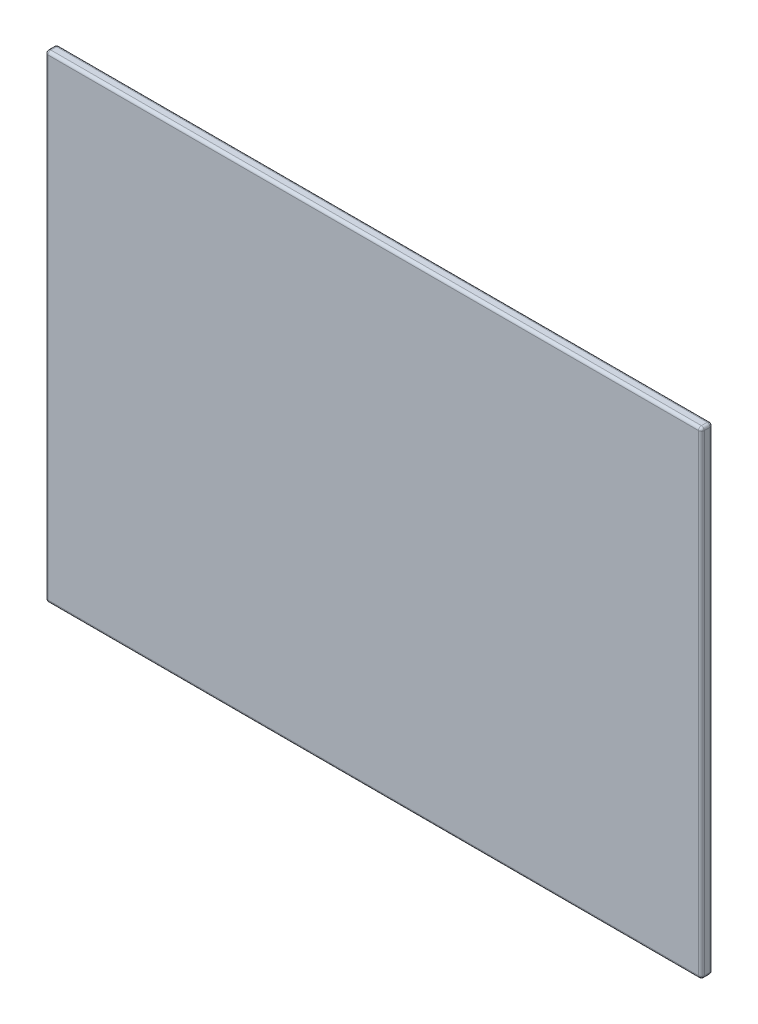
ISO-10303-21;
HEADER;
FILE_DESCRIPTION(('STEP AP214'),'2;1');
FILE_NAME('part.step','',(''),(''),'','','');
FILE_SCHEMA(('AUTOMOTIVE_DESIGN { 1 0 10303 214 1 1 1 1 }'));
ENDSEC;
DATA;
#1=APPLICATION_CONTEXT('core data for automotive mechanical design processes');
#2=APPLICATION_PROTOCOL_DEFINITION('international standard','automotive_design',2000,#1);
#3=PRODUCT_CONTEXT('',#1,'mechanical');
#4=PRODUCT('Part','Part','',(#3));
#5=PRODUCT_RELATED_PRODUCT_CATEGORY('part','',(#4));
#6=PRODUCT_DEFINITION_FORMATION('','',#4);
#7=PRODUCT_DEFINITION_CONTEXT('part definition',#1,'design');
#8=PRODUCT_DEFINITION('design','',#6,#7);
#9=PRODUCT_DEFINITION_SHAPE('','',#8);
#10=(LENGTH_UNIT() NAMED_UNIT(*) SI_UNIT(.MILLI.,.METRE.));
#11=(NAMED_UNIT(*) PLANE_ANGLE_UNIT() SI_UNIT($,.RADIAN.));
#12=(NAMED_UNIT(*) SI_UNIT($,.STERADIAN.) SOLID_ANGLE_UNIT());
#13=UNCERTAINTY_MEASURE_WITH_UNIT(LENGTH_MEASURE(1.E-05),#10,'distance_accuracy_value','');
#14=(GEOMETRIC_REPRESENTATION_CONTEXT(3) GLOBAL_UNCERTAINTY_ASSIGNED_CONTEXT((#13)) GLOBAL_UNIT_ASSIGNED_CONTEXT((#10,
#11,#12)) REPRESENTATION_CONTEXT('',''));
#15=CARTESIAN_POINT('',(0.,0.,0.));
#16=DIRECTION('',(0.,0.,1.));
#17=DIRECTION('',(1.,0.,0.));
#18=AXIS2_PLACEMENT_3D('',#15,#16,#17);
#19=CARTESIAN_POINT('',(57.35,-41.75,2.));
#20=DIRECTION('',(-1.,0.,0.));
#21=DIRECTION('',(0.,0.,1.));
#22=AXIS2_PLACEMENT_3D('',#19,#20,#21);
#23=PLANE('',#22);
#24=DIRECTION('',(0.,1.,0.));
#25=VECTOR('',#24,1.);
#26=CARTESIAN_POINT('',(57.35,-41.75,1.5));
#27=LINE('',#26,#25);
#28=CARTESIAN_POINT('',(57.35,41.25,1.5));
#29=VERTEX_POINT('',#28);
#30=CARTESIAN_POINT('',(57.35,-41.25,1.5));
#31=VERTEX_POINT('',#30);
#32=EDGE_CURVE('E42',#29,#31,#27,.F.);
#33=ORIENTED_EDGE('',*,*,#32,.T.);
#34=DIRECTION('',(0.,0.,-1.));
#35=VECTOR('',#34,1.);
#36=CARTESIAN_POINT('',(57.35,-41.25,2.));
#37=LINE('',#36,#35);
#38=CARTESIAN_POINT('',(57.35,-41.25,0.5));
#39=VERTEX_POINT('',#38);
#40=EDGE_CURVE('E11',#31,#39,#37,.T.);
#41=ORIENTED_EDGE('',*,*,#40,.T.);
#42=DIRECTION('',(0.,1.,0.));
#43=VECTOR('',#42,1.);
#44=CARTESIAN_POINT('',(57.35,41.75,0.5));
#45=LINE('',#44,#43);
#46=CARTESIAN_POINT('',(57.35,41.25,0.5));
#47=VERTEX_POINT('',#46);
#48=EDGE_CURVE('E194',#39,#47,#45,.T.);
#49=ORIENTED_EDGE('',*,*,#48,.T.);
#50=DIRECTION('',(0.,0.,-1.));
#51=VECTOR('',#50,1.);
#52=CARTESIAN_POINT('',(57.35,41.25,2.));
#53=LINE('',#52,#51);
#54=EDGE_CURVE('E53',#47,#29,#53,.F.);
#55=ORIENTED_EDGE('',*,*,#54,.T.);
#56=EDGE_LOOP('',(#33,#41,#49,#55));
#57=FACE_BOUND('',#56,.T.);
#58=ADVANCED_FACE('F33',(#57),#23,.F.);
#59=CARTESIAN_POINT('',(-57.35,41.75,2.));
#60=DIRECTION('',(0.,-1.,0.));
#61=DIRECTION('',(0.,0.,-1.));
#62=AXIS2_PLACEMENT_3D('',#59,#60,#61);
#63=PLANE('',#62);
#64=DIRECTION('',(0.,0.,-1.));
#65=VECTOR('',#64,1.);
#66=CARTESIAN_POINT('',(-56.85,41.75,2.));
#67=LINE('',#66,#65);
#68=CARTESIAN_POINT('',(-56.85,41.75,0.5));
#69=VERTEX_POINT('',#68);
#70=CARTESIAN_POINT('',(-56.85,41.75,1.5));
#71=VERTEX_POINT('',#70);
#72=EDGE_CURVE('E189',#69,#71,#67,.F.);
#73=ORIENTED_EDGE('',*,*,#72,.T.);
#74=DIRECTION('',(-1.,0.,0.));
#75=VECTOR('',#74,1.);
#76=CARTESIAN_POINT('',(-57.35,41.75,1.5));
#77=LINE('',#76,#75);
#78=CARTESIAN_POINT('',(56.85,41.75,1.5));
#79=VERTEX_POINT('',#78);
#80=EDGE_CURVE('E191',#71,#79,#77,.F.);
#81=ORIENTED_EDGE('',*,*,#80,.T.);
#82=DIRECTION('',(0.,0.,-1.));
#83=VECTOR('',#82,1.);
#84=CARTESIAN_POINT('',(56.85,41.75,2.));
#85=LINE('',#84,#83);
#86=CARTESIAN_POINT('',(56.85,41.75,0.5));
#87=VERTEX_POINT('',#86);
#88=EDGE_CURVE('E185',#79,#87,#85,.T.);
#89=ORIENTED_EDGE('',*,*,#88,.T.);
#90=DIRECTION('',(-1.,0.,0.));
#91=VECTOR('',#90,1.);
#92=CARTESIAN_POINT('',(-57.35,41.75,0.5));
#93=LINE('',#92,#91);
#94=EDGE_CURVE('E187',#87,#69,#93,.T.);
#95=ORIENTED_EDGE('',*,*,#94,.T.);
#96=EDGE_LOOP('',(#73,#81,#89,#95));
#97=FACE_BOUND('',#96,.T.);
#98=ADVANCED_FACE('F278',(#97),#63,.F.);
#99=CARTESIAN_POINT('',(-57.35,-41.75,2.));
#100=DIRECTION('',(1.,0.,0.));
#101=DIRECTION('',(0.,0.,-1.));
#102=AXIS2_PLACEMENT_3D('',#99,#100,#101);
#103=PLANE('',#102);
#104=DIRECTION('',(0.,0.,-1.));
#105=VECTOR('',#104,1.);
#106=CARTESIAN_POINT('',(-57.35,-41.25,2.));
#107=LINE('',#106,#105);
#108=CARTESIAN_POINT('',(-57.35,-41.25,0.5));
#109=VERTEX_POINT('',#108);
#110=CARTESIAN_POINT('',(-57.35,-41.25,1.5));
#111=VERTEX_POINT('',#110);
#112=EDGE_CURVE('E180',#109,#111,#107,.F.);
#113=ORIENTED_EDGE('',*,*,#112,.T.);
#114=DIRECTION('',(0.,-1.,0.));
#115=VECTOR('',#114,1.);
#116=CARTESIAN_POINT('',(-57.35,-41.75,1.5));
#117=LINE('',#116,#115);
#118=CARTESIAN_POINT('',(-57.35,41.25,1.5));
#119=VERTEX_POINT('',#118);
#120=EDGE_CURVE('E182',#111,#119,#117,.F.);
#121=ORIENTED_EDGE('',*,*,#120,.T.);
#122=DIRECTION('',(0.,0.,-1.));
#123=VECTOR('',#122,1.);
#124=CARTESIAN_POINT('',(-57.35,41.25,2.));
#125=LINE('',#124,#123);
#126=CARTESIAN_POINT('',(-57.35,41.25,0.5));
#127=VERTEX_POINT('',#126);
#128=EDGE_CURVE('E176',#119,#127,#125,.T.);
#129=ORIENTED_EDGE('',*,*,#128,.T.);
#130=DIRECTION('',(0.,-1.,0.));
#131=VECTOR('',#130,1.);
#132=CARTESIAN_POINT('',(-57.35,-41.75,0.5));
#133=LINE('',#132,#131);
#134=EDGE_CURVE('E178',#127,#109,#133,.T.);
#135=ORIENTED_EDGE('',*,*,#134,.T.);
#136=EDGE_LOOP('',(#113,#121,#129,#135));
#137=FACE_BOUND('',#136,.T.);
#138=ADVANCED_FACE('F269',(#137),#103,.F.);
#139=CARTESIAN_POINT('',(-57.35,-41.75,2.));
#140=DIRECTION('',(0.,1.,0.));
#141=DIRECTION('',(0.,0.,1.));
#142=AXIS2_PLACEMENT_3D('',#139,#140,#141);
#143=PLANE('',#142);
#144=DIRECTION('',(1.,0.,0.));
#145=VECTOR('',#144,1.);
#146=CARTESIAN_POINT('',(-57.35,-41.75,1.5));
#147=LINE('',#146,#145);
#148=CARTESIAN_POINT('',(56.85,-41.75,1.5));
#149=VERTEX_POINT('',#148);
#150=CARTESIAN_POINT('',(-56.85,-41.75,1.5));
#151=VERTEX_POINT('',#150);
#152=EDGE_CURVE('E129',#149,#151,#147,.F.);
#153=ORIENTED_EDGE('',*,*,#152,.T.);
#154=DIRECTION('',(0.,0.,-1.));
#155=VECTOR('',#154,1.);
#156=CARTESIAN_POINT('',(-56.85,-41.75,2.));
#157=LINE('',#156,#155);
#158=CARTESIAN_POINT('',(-56.85,-41.75,0.5));
#159=VERTEX_POINT('',#158);
#160=EDGE_CURVE('E165',#151,#159,#157,.T.);
#161=ORIENTED_EDGE('',*,*,#160,.T.);
#162=DIRECTION('',(1.,0.,0.));
#163=VECTOR('',#162,1.);
#164=CARTESIAN_POINT('',(57.35,-41.75,0.5));
#165=LINE('',#164,#163);
#166=CARTESIAN_POINT('',(56.85,-41.75,0.5));
#167=VERTEX_POINT('',#166);
#168=EDGE_CURVE('E158',#159,#167,#165,.T.);
#169=ORIENTED_EDGE('',*,*,#168,.T.);
#170=DIRECTION('',(0.,0.,-1.));
#171=VECTOR('',#170,1.);
#172=CARTESIAN_POINT('',(56.85,-41.75,2.));
#173=LINE('',#172,#171);
#174=EDGE_CURVE('E156',#167,#149,#173,.F.);
#175=ORIENTED_EDGE('',*,*,#174,.T.);
#176=EDGE_LOOP('',(#153,#161,#169,#175));
#177=FACE_BOUND('',#176,.T.);
#178=ADVANCED_FACE('F356',(#177),#143,.F.);
#179=CARTESIAN_POINT('',(0.,0.,2.));
#180=DIRECTION('',(0.,0.,-1.));
#181=DIRECTION('',(-1.,0.,0.));
#182=AXIS2_PLACEMENT_3D('',#179,#180,#181);
#183=PLANE('',#182);
#184=DIRECTION('',(0.,-1.,0.));
#185=VECTOR('',#184,1.);
#186=CARTESIAN_POINT('',(-56.85,0.,2.));
#187=LINE('',#186,#185);
#188=CARTESIAN_POINT('',(-56.85,41.25,2.));
#189=VERTEX_POINT('',#188);
#190=CARTESIAN_POINT('',(-56.85,-41.25,2.));
#191=VERTEX_POINT('',#190);
#192=EDGE_CURVE('E154',#189,#191,#187,.T.);
#193=ORIENTED_EDGE('',*,*,#192,.T.);
#194=DIRECTION('',(1.,0.,0.));
#195=VECTOR('',#194,1.);
#196=CARTESIAN_POINT('',(0.,-41.25,2.));
#197=LINE('',#196,#195);
#198=CARTESIAN_POINT('',(56.85,-41.25,2.));
#199=VERTEX_POINT('',#198);
#200=EDGE_CURVE('E127',#191,#199,#197,.T.);
#201=ORIENTED_EDGE('',*,*,#200,.T.);
#202=DIRECTION('',(0.,1.,0.));
#203=VECTOR('',#202,1.);
#204=CARTESIAN_POINT('',(56.85,0.,2.));
#205=LINE('',#204,#203);
#206=CARTESIAN_POINT('',(56.85,41.25,2.));
#207=VERTEX_POINT('',#206);
#208=EDGE_CURVE('E144',#199,#207,#205,.T.);
#209=ORIENTED_EDGE('',*,*,#208,.T.);
#210=DIRECTION('',(-1.,0.,0.));
#211=VECTOR('',#210,1.);
#212=CARTESIAN_POINT('',(0.,41.25,2.));
#213=LINE('',#212,#211);
#214=EDGE_CURVE('E150',#207,#189,#213,.T.);
#215=ORIENTED_EDGE('',*,*,#214,.T.);
#216=EDGE_LOOP('',(#193,#201,#209,#215));
#217=FACE_BOUND('',#216,.T.);
#218=ADVANCED_FACE('F152',(#217),#183,.F.);
#219=CARTESIAN_POINT('',(0.,0.,0.));
#220=DIRECTION('',(0.,0.,-1.));
#221=DIRECTION('',(-1.,0.,0.));
#222=AXIS2_PLACEMENT_3D('',#219,#220,#221);
#223=PLANE('',#222);
#224=DIRECTION('',(0.,1.,0.));
#225=VECTOR('',#224,1.);
#226=CARTESIAN_POINT('',(56.85,-41.75,0.));
#227=LINE('',#226,#225);
#228=CARTESIAN_POINT('',(56.85,41.25,0.));
#229=VERTEX_POINT('',#228);
#230=CARTESIAN_POINT('',(56.85,-41.25,0.));
#231=VERTEX_POINT('',#230);
#232=EDGE_CURVE('E167',#229,#231,#227,.F.);
#233=ORIENTED_EDGE('',*,*,#232,.T.);
#234=DIRECTION('',(1.,0.,0.));
#235=VECTOR('',#234,1.);
#236=CARTESIAN_POINT('',(-57.35,-41.25,0.));
#237=LINE('',#236,#235);
#238=CARTESIAN_POINT('',(-56.85,-41.25,0.));
#239=VERTEX_POINT('',#238);
#240=EDGE_CURVE('E173',#231,#239,#237,.F.);
#241=ORIENTED_EDGE('',*,*,#240,.T.);
#242=DIRECTION('',(0.,-1.,0.));
#243=VECTOR('',#242,1.);
#244=CARTESIAN_POINT('',(-56.85,41.75,0.));
#245=LINE('',#244,#243);
#246=CARTESIAN_POINT('',(-56.85,41.25,0.));
#247=VERTEX_POINT('',#246);
#248=EDGE_CURVE('E171',#239,#247,#245,.F.);
#249=ORIENTED_EDGE('',*,*,#248,.T.);
#250=DIRECTION('',(-1.,0.,0.));
#251=VECTOR('',#250,1.);
#252=CARTESIAN_POINT('',(57.35,41.25,0.));
#253=LINE('',#252,#251);
#254=EDGE_CURVE('E169',#247,#229,#253,.F.);
#255=ORIENTED_EDGE('',*,*,#254,.T.);
#256=EDGE_LOOP('',(#233,#241,#249,#255));
#257=FACE_BOUND('',#256,.T.);
#258=ADVANCED_FACE('F296',(#257),#223,.T.);
#259=CARTESIAN_POINT('',(-57.35,41.25,0.5));
#260=DIRECTION('',(1.,0.,0.));
#261=DIRECTION('',(0.,0.,-1.));
#262=AXIS2_PLACEMENT_3D('',#259,#260,#261);
#263=CYLINDRICAL_SURFACE('',#262,0.5);
#264=CARTESIAN_POINT('',(-56.85,41.25,0.5));
#265=DIRECTION('',(-1.,0.,0.));
#266=DIRECTION('',(0.,0.,1.));
#267=AXIS2_PLACEMENT_3D('',#264,#265,#266);
#268=CIRCLE('',#267,0.5);
#269=EDGE_CURVE('E37',#69,#247,#268,.T.);
#270=ORIENTED_EDGE('',*,*,#269,.F.);
#271=ORIENTED_EDGE('',*,*,#94,.F.);
#272=CARTESIAN_POINT('',(56.85,41.25,0.5));
#273=DIRECTION('',(1.,0.,0.));
#274=DIRECTION('',(0.,0.,-1.));
#275=AXIS2_PLACEMENT_3D('',#272,#273,#274);
#276=CIRCLE('',#275,0.5);
#277=EDGE_CURVE('E246',#229,#87,#276,.T.);
#278=ORIENTED_EDGE('',*,*,#277,.F.);
#279=ORIENTED_EDGE('',*,*,#254,.F.);
#280=EDGE_LOOP('',(#270,#271,#278,#279));
#281=FACE_BOUND('',#280,.T.);
#282=ADVANCED_FACE('F35',(#281),#263,.T.);
#283=CARTESIAN_POINT('',(-56.85,41.25,0.5));
#284=DIRECTION('',(0.,0.,1.));
#285=DIRECTION('',(1.,0.,0.));
#286=AXIS2_PLACEMENT_3D('',#283,#284,#285);
#287=SPHERICAL_SURFACE('',#286,0.5);
#288=CARTESIAN_POINT('',(-56.85,41.25,0.5));
#289=DIRECTION('',(0.,0.,-1.));
#290=DIRECTION('',(-1.,0.,0.));
#291=AXIS2_PLACEMENT_3D('',#288,#289,#290);
#292=CIRCLE('',#291,0.5);
#293=EDGE_CURVE('E241',#69,#127,#292,.F.);
#294=ORIENTED_EDGE('',*,*,#293,.F.);
#295=ORIENTED_EDGE('',*,*,#269,.T.);
#296=CARTESIAN_POINT('',(-56.85,41.25,0.5));
#297=DIRECTION('',(0.,1.,0.));
#298=DIRECTION('',(0.,0.,1.));
#299=AXIS2_PLACEMENT_3D('',#296,#297,#298);
#300=CIRCLE('',#299,0.5);
#301=EDGE_CURVE('E244',#127,#247,#300,.F.);
#302=ORIENTED_EDGE('',*,*,#301,.F.);
#303=EDGE_LOOP('',(#294,#295,#302));
#304=FACE_BOUND('',#303,.T.);
#305=ADVANCED_FACE('F257',(#304),#287,.T.);
#306=CARTESIAN_POINT('',(56.85,41.25,0.5));
#307=DIRECTION('',(0.,0.,1.));
#308=DIRECTION('',(1.,0.,0.));
#309=AXIS2_PLACEMENT_3D('',#306,#307,#308);
#310=SPHERICAL_SURFACE('',#309,0.5);
#311=CARTESIAN_POINT('',(56.85,41.25,0.5));
#312=DIRECTION('',(0.,1.,0.));
#313=DIRECTION('',(0.,0.,1.));
#314=AXIS2_PLACEMENT_3D('',#311,#312,#313);
#315=CIRCLE('',#314,0.5);
#316=EDGE_CURVE('E235',#229,#47,#315,.F.);
#317=ORIENTED_EDGE('',*,*,#316,.F.);
#318=ORIENTED_EDGE('',*,*,#277,.T.);
#319=CARTESIAN_POINT('',(56.85,41.25,0.5));
#320=DIRECTION('',(0.,0.,-1.));
#321=DIRECTION('',(-1.,0.,0.));
#322=AXIS2_PLACEMENT_3D('',#319,#320,#321);
#323=CIRCLE('',#322,0.5);
#324=EDGE_CURVE('E238',#47,#87,#323,.F.);
#325=ORIENTED_EDGE('',*,*,#324,.F.);
#326=EDGE_LOOP('',(#317,#318,#325));
#327=FACE_BOUND('',#326,.T.);
#328=ADVANCED_FACE('F289',(#327),#310,.T.);
#329=CARTESIAN_POINT('',(-56.85,-41.75,0.5));
#330=DIRECTION('',(0.,1.,0.));
#331=DIRECTION('',(0.,0.,1.));
#332=AXIS2_PLACEMENT_3D('',#329,#330,#331);
#333=CYLINDRICAL_SURFACE('',#332,0.5);
#334=ORIENTED_EDGE('',*,*,#301,.T.);
#335=ORIENTED_EDGE('',*,*,#248,.F.);
#336=CARTESIAN_POINT('',(-56.85,-41.25,0.5));
#337=DIRECTION('',(0.,-1.,0.));
#338=DIRECTION('',(0.,0.,-1.));
#339=AXIS2_PLACEMENT_3D('',#336,#337,#338);
#340=CIRCLE('',#339,0.5);
#341=EDGE_CURVE('E230',#109,#239,#340,.T.);
#342=ORIENTED_EDGE('',*,*,#341,.F.);
#343=ORIENTED_EDGE('',*,*,#134,.F.);
#344=EDGE_LOOP('',(#334,#335,#342,#343));
#345=FACE_BOUND('',#344,.T.);
#346=ADVANCED_FACE('F265',(#345),#333,.T.);
#347=CARTESIAN_POINT('',(-56.85,41.25,2.));
#348=DIRECTION('',(0.,0.,-1.));
#349=DIRECTION('',(-1.,0.,0.));
#350=AXIS2_PLACEMENT_3D('',#347,#348,#349);
#351=CYLINDRICAL_SURFACE('',#350,0.5);
#352=ORIENTED_EDGE('',*,*,#293,.T.);
#353=ORIENTED_EDGE('',*,*,#128,.F.);
#354=CARTESIAN_POINT('',(-56.85,41.25,1.5));
#355=DIRECTION('',(0.,0.,1.));
#356=DIRECTION('',(1.,0.,0.));
#357=AXIS2_PLACEMENT_3D('',#354,#355,#356);
#358=CIRCLE('',#357,0.5);
#359=EDGE_CURVE('E227',#71,#119,#358,.T.);
#360=ORIENTED_EDGE('',*,*,#359,.F.);
#361=ORIENTED_EDGE('',*,*,#72,.F.);
#362=EDGE_LOOP('',(#352,#353,#360,#361));
#363=FACE_BOUND('',#362,.T.);
#364=ADVANCED_FACE('F275',(#363),#351,.T.);
#365=CARTESIAN_POINT('',(0.,41.25,1.5));
#366=DIRECTION('',(-1.,0.,0.));
#367=DIRECTION('',(0.,0.,1.));
#368=AXIS2_PLACEMENT_3D('',#365,#366,#367);
#369=CYLINDRICAL_SURFACE('',#368,0.5);
#370=CARTESIAN_POINT('',(56.85,41.25,1.5));
#371=DIRECTION('',(1.,0.,0.));
#372=DIRECTION('',(0.,0.,-1.));
#373=AXIS2_PLACEMENT_3D('',#370,#371,#372);
#374=CIRCLE('',#373,0.5);
#375=EDGE_CURVE('E221',#79,#207,#374,.T.);
#376=ORIENTED_EDGE('',*,*,#375,.F.);
#377=ORIENTED_EDGE('',*,*,#80,.F.);
#378=CARTESIAN_POINT('',(-56.85,41.25,1.5));
#379=DIRECTION('',(-1.,0.,0.));
#380=DIRECTION('',(0.,0.,1.));
#381=AXIS2_PLACEMENT_3D('',#378,#379,#380);
#382=CIRCLE('',#381,0.5);
#383=EDGE_CURVE('E224',#189,#71,#382,.T.);
#384=ORIENTED_EDGE('',*,*,#383,.F.);
#385=ORIENTED_EDGE('',*,*,#214,.F.);
#386=EDGE_LOOP('',(#376,#377,#384,#385));
#387=FACE_BOUND('',#386,.T.);
#388=ADVANCED_FACE('F282',(#387),#369,.T.);
#389=CARTESIAN_POINT('',(56.85,41.25,2.));
#390=DIRECTION('',(0.,0.,-1.));
#391=DIRECTION('',(-1.,0.,0.));
#392=AXIS2_PLACEMENT_3D('',#389,#390,#391);
#393=CYLINDRICAL_SURFACE('',#392,0.5);
#394=ORIENTED_EDGE('',*,*,#324,.T.);
#395=ORIENTED_EDGE('',*,*,#88,.F.);
#396=CARTESIAN_POINT('',(56.85,41.25,1.5));
#397=DIRECTION('',(0.,0.,1.));
#398=DIRECTION('',(1.,0.,0.));
#399=AXIS2_PLACEMENT_3D('',#396,#397,#398);
#400=CIRCLE('',#399,0.5);
#401=EDGE_CURVE('E219',#29,#79,#400,.T.);
#402=ORIENTED_EDGE('',*,*,#401,.F.);
#403=ORIENTED_EDGE('',*,*,#54,.F.);
#404=EDGE_LOOP('',(#394,#395,#402,#403));
#405=FACE_BOUND('',#404,.T.);
#406=ADVANCED_FACE('F287',(#405),#393,.T.);
#407=CARTESIAN_POINT('',(56.85,-41.75,0.5));
#408=DIRECTION('',(0.,-1.,0.));
#409=DIRECTION('',(0.,0.,-1.));
#410=AXIS2_PLACEMENT_3D('',#407,#408,#409);
#411=CYLINDRICAL_SURFACE('',#410,0.5);
#412=ORIENTED_EDGE('',*,*,#316,.T.);
#413=ORIENTED_EDGE('',*,*,#48,.F.);
#414=CARTESIAN_POINT('',(56.85,-41.25,0.5));
#415=DIRECTION('',(0.,-1.,0.));
#416=DIRECTION('',(0.,0.,-1.));
#417=AXIS2_PLACEMENT_3D('',#414,#415,#416);
#418=CIRCLE('',#417,0.5);
#419=EDGE_CURVE('E216',#231,#39,#418,.T.);
#420=ORIENTED_EDGE('',*,*,#419,.F.);
#421=ORIENTED_EDGE('',*,*,#232,.F.);
#422=EDGE_LOOP('',(#412,#413,#420,#421));
#423=FACE_BOUND('',#422,.T.);
#424=ADVANCED_FACE('F293',(#423),#411,.T.);
#425=CARTESIAN_POINT('',(-57.35,-41.25,0.5));
#426=DIRECTION('',(-1.,0.,0.));
#427=DIRECTION('',(0.,0.,1.));
#428=AXIS2_PLACEMENT_3D('',#425,#426,#427);
#429=CYLINDRICAL_SURFACE('',#428,0.5);
#430=CARTESIAN_POINT('',(-56.85,-41.25,0.5));
#431=DIRECTION('',(-1.,0.,0.));
#432=DIRECTION('',(0.,0.,1.));
#433=AXIS2_PLACEMENT_3D('',#430,#431,#432);
#434=CIRCLE('',#433,0.5);
#435=EDGE_CURVE('E232',#239,#159,#434,.T.);
#436=ORIENTED_EDGE('',*,*,#435,.F.);
#437=ORIENTED_EDGE('',*,*,#240,.F.);
#438=CARTESIAN_POINT('',(56.85,-41.25,0.5));
#439=DIRECTION('',(1.,0.,0.));
#440=DIRECTION('',(0.,0.,-1.));
#441=AXIS2_PLACEMENT_3D('',#438,#439,#440);
#442=CIRCLE('',#441,0.5);
#443=EDGE_CURVE('E213',#167,#231,#442,.T.);
#444=ORIENTED_EDGE('',*,*,#443,.F.);
#445=ORIENTED_EDGE('',*,*,#168,.F.);
#446=EDGE_LOOP('',(#436,#437,#444,#445));
#447=FACE_BOUND('',#446,.T.);
#448=ADVANCED_FACE('F300',(#447),#429,.T.);
#449=CARTESIAN_POINT('',(-56.85,-41.25,0.5));
#450=DIRECTION('',(0.,0.,1.));
#451=DIRECTION('',(1.,0.,0.));
#452=AXIS2_PLACEMENT_3D('',#449,#450,#451);
#453=SPHERICAL_SURFACE('',#452,0.5);
#454=ORIENTED_EDGE('',*,*,#341,.T.);
#455=ORIENTED_EDGE('',*,*,#435,.T.);
#456=CARTESIAN_POINT('',(-56.85,-41.25,0.5));
#457=DIRECTION('',(0.,0.,-1.));
#458=DIRECTION('',(-1.,0.,0.));
#459=AXIS2_PLACEMENT_3D('',#456,#457,#458);
#460=CIRCLE('',#459,0.5);
#461=EDGE_CURVE('E210',#109,#159,#460,.F.);
#462=ORIENTED_EDGE('',*,*,#461,.F.);
#463=EDGE_LOOP('',(#454,#455,#462));
#464=FACE_BOUND('',#463,.T.);
#465=ADVANCED_FACE('F304',(#464),#453,.T.);
#466=CARTESIAN_POINT('',(-56.85,41.25,1.5));
#467=DIRECTION('',(0.,0.,1.));
#468=DIRECTION('',(1.,0.,0.));
#469=AXIS2_PLACEMENT_3D('',#466,#467,#468);
#470=SPHERICAL_SURFACE('',#469,0.5);
#471=ORIENTED_EDGE('',*,*,#383,.T.);
#472=ORIENTED_EDGE('',*,*,#359,.T.);
#473=CARTESIAN_POINT('',(-56.85,41.25,1.5));
#474=DIRECTION('',(0.,1.,0.));
#475=DIRECTION('',(0.,0.,1.));
#476=AXIS2_PLACEMENT_3D('',#473,#474,#475);
#477=CIRCLE('',#476,0.5);
#478=EDGE_CURVE('E208',#189,#119,#477,.F.);
#479=ORIENTED_EDGE('',*,*,#478,.F.);
#480=EDGE_LOOP('',(#471,#472,#479));
#481=FACE_BOUND('',#480,.T.);
#482=ADVANCED_FACE('F315',(#481),#470,.T.);
#483=CARTESIAN_POINT('',(56.85,41.25,1.5));
#484=DIRECTION('',(0.,0.,1.));
#485=DIRECTION('',(1.,0.,0.));
#486=AXIS2_PLACEMENT_3D('',#483,#484,#485);
#487=SPHERICAL_SURFACE('',#486,0.5);
#488=ORIENTED_EDGE('',*,*,#401,.T.);
#489=ORIENTED_EDGE('',*,*,#375,.T.);
#490=CARTESIAN_POINT('',(56.85,41.25,1.5));
#491=DIRECTION('',(0.,1.,0.));
#492=DIRECTION('',(0.,0.,1.));
#493=AXIS2_PLACEMENT_3D('',#490,#491,#492);
#494=CIRCLE('',#493,0.5);
#495=EDGE_CURVE('E147',#29,#207,#494,.F.);
#496=ORIENTED_EDGE('',*,*,#495,.F.);
#497=EDGE_LOOP('',(#488,#489,#496));
#498=FACE_BOUND('',#497,.T.);
#499=ADVANCED_FACE('F317',(#498),#487,.T.);
#500=CARTESIAN_POINT('',(56.85,-41.25,0.5));
#501=DIRECTION('',(0.,0.,1.));
#502=DIRECTION('',(1.,0.,0.));
#503=AXIS2_PLACEMENT_3D('',#500,#501,#502);
#504=SPHERICAL_SURFACE('',#503,0.5);
#505=ORIENTED_EDGE('',*,*,#443,.T.);
#506=ORIENTED_EDGE('',*,*,#419,.T.);
#507=CARTESIAN_POINT('',(56.85,-41.25,0.5));
#508=DIRECTION('',(0.,0.,-1.));
#509=DIRECTION('',(-1.,0.,0.));
#510=AXIS2_PLACEMENT_3D('',#507,#508,#509);
#511=CIRCLE('',#510,0.5);
#512=EDGE_CURVE('E205',#167,#39,#511,.F.);
#513=ORIENTED_EDGE('',*,*,#512,.F.);
#514=EDGE_LOOP('',(#505,#506,#513));
#515=FACE_BOUND('',#514,.T.);
#516=ADVANCED_FACE('F323',(#515),#504,.T.);
#517=CARTESIAN_POINT('',(-56.85,-41.25,2.));
#518=DIRECTION('',(0.,0.,-1.));
#519=DIRECTION('',(-1.,0.,0.));
#520=AXIS2_PLACEMENT_3D('',#517,#518,#519);
#521=CYLINDRICAL_SURFACE('',#520,0.5);
#522=ORIENTED_EDGE('',*,*,#461,.T.);
#523=ORIENTED_EDGE('',*,*,#160,.F.);
#524=CARTESIAN_POINT('',(-56.85,-41.25,1.5));
#525=DIRECTION('',(0.,0.,1.));
#526=DIRECTION('',(1.,0.,0.));
#527=AXIS2_PLACEMENT_3D('',#524,#525,#526);
#528=CIRCLE('',#527,0.5);
#529=EDGE_CURVE('E202',#111,#151,#528,.T.);
#530=ORIENTED_EDGE('',*,*,#529,.F.);
#531=ORIENTED_EDGE('',*,*,#112,.F.);
#532=EDGE_LOOP('',(#522,#523,#530,#531));
#533=FACE_BOUND('',#532,.T.);
#534=ADVANCED_FACE('F307',(#533),#521,.T.);
#535=CARTESIAN_POINT('',(-56.85,0.,1.5));
#536=DIRECTION('',(0.,-1.,0.));
#537=DIRECTION('',(0.,0.,-1.));
#538=AXIS2_PLACEMENT_3D('',#535,#536,#537);
#539=CYLINDRICAL_SURFACE('',#538,0.5);
#540=ORIENTED_EDGE('',*,*,#478,.T.);
#541=ORIENTED_EDGE('',*,*,#120,.F.);
#542=CARTESIAN_POINT('',(-56.85,-41.25,1.5));
#543=DIRECTION('',(0.,-1.,0.));
#544=DIRECTION('',(0.,0.,-1.));
#545=AXIS2_PLACEMENT_3D('',#542,#543,#544);
#546=CIRCLE('',#545,0.5);
#547=EDGE_CURVE('E141',#191,#111,#546,.T.);
#548=ORIENTED_EDGE('',*,*,#547,.F.);
#549=ORIENTED_EDGE('',*,*,#192,.F.);
#550=EDGE_LOOP('',(#540,#541,#548,#549));
#551=FACE_BOUND('',#550,.T.);
#552=ADVANCED_FACE('F313',(#551),#539,.T.);
#553=CARTESIAN_POINT('',(56.85,0.,1.5));
#554=DIRECTION('',(0.,1.,0.));
#555=DIRECTION('',(0.,0.,1.));
#556=AXIS2_PLACEMENT_3D('',#553,#554,#555);
#557=CYLINDRICAL_SURFACE('',#556,0.5);
#558=ORIENTED_EDGE('',*,*,#495,.T.);
#559=ORIENTED_EDGE('',*,*,#208,.F.);
#560=CARTESIAN_POINT('',(56.85,-41.25,1.5));
#561=DIRECTION('',(0.,-1.,0.));
#562=DIRECTION('',(0.,0.,-1.));
#563=AXIS2_PLACEMENT_3D('',#560,#561,#562);
#564=CIRCLE('',#563,0.5);
#565=EDGE_CURVE('E135',#31,#199,#564,.T.);
#566=ORIENTED_EDGE('',*,*,#565,.F.);
#567=ORIENTED_EDGE('',*,*,#32,.F.);
#568=EDGE_LOOP('',(#558,#559,#566,#567));
#569=FACE_BOUND('',#568,.T.);
#570=ADVANCED_FACE('F145',(#569),#557,.T.);
#571=CARTESIAN_POINT('',(56.85,-41.25,2.));
#572=DIRECTION('',(0.,0.,-1.));
#573=DIRECTION('',(-1.,0.,0.));
#574=AXIS2_PLACEMENT_3D('',#571,#572,#573);
#575=CYLINDRICAL_SURFACE('',#574,0.5);
#576=ORIENTED_EDGE('',*,*,#512,.T.);
#577=ORIENTED_EDGE('',*,*,#40,.F.);
#578=CARTESIAN_POINT('',(56.85,-41.25,1.5));
#579=DIRECTION('',(0.,0.,1.));
#580=DIRECTION('',(1.,0.,0.));
#581=AXIS2_PLACEMENT_3D('',#578,#579,#580);
#582=CIRCLE('',#581,0.5);
#583=EDGE_CURVE('E139',#149,#31,#582,.T.);
#584=ORIENTED_EDGE('',*,*,#583,.F.);
#585=ORIENTED_EDGE('',*,*,#174,.F.);
#586=EDGE_LOOP('',(#576,#577,#584,#585));
#587=FACE_BOUND('',#586,.T.);
#588=ADVANCED_FACE('F340',(#587),#575,.T.);
#589=CARTESIAN_POINT('',(-56.85,-41.25,1.5));
#590=DIRECTION('',(0.,0.,1.));
#591=DIRECTION('',(1.,0.,0.));
#592=AXIS2_PLACEMENT_3D('',#589,#590,#591);
#593=SPHERICAL_SURFACE('',#592,0.5);
#594=ORIENTED_EDGE('',*,*,#547,.T.);
#595=ORIENTED_EDGE('',*,*,#529,.T.);
#596=CARTESIAN_POINT('',(-56.85,-41.25,1.5));
#597=DIRECTION('',(-1.,0.,0.));
#598=DIRECTION('',(0.,0.,1.));
#599=AXIS2_PLACEMENT_3D('',#596,#597,#598);
#600=CIRCLE('',#599,0.5);
#601=EDGE_CURVE('E132',#191,#151,#600,.F.);
#602=ORIENTED_EDGE('',*,*,#601,.F.);
#603=EDGE_LOOP('',(#594,#595,#602));
#604=FACE_BOUND('',#603,.T.);
#605=ADVANCED_FACE('F311',(#604),#593,.T.);
#606=CARTESIAN_POINT('',(56.85,-41.25,1.5));
#607=DIRECTION('',(0.,0.,1.));
#608=DIRECTION('',(1.,0.,0.));
#609=AXIS2_PLACEMENT_3D('',#606,#607,#608);
#610=SPHERICAL_SURFACE('',#609,0.5);
#611=ORIENTED_EDGE('',*,*,#583,.T.);
#612=ORIENTED_EDGE('',*,*,#565,.T.);
#613=CARTESIAN_POINT('',(56.85,-41.25,1.5));
#614=DIRECTION('',(1.,0.,0.));
#615=DIRECTION('',(0.,0.,-1.));
#616=AXIS2_PLACEMENT_3D('',#613,#614,#615);
#617=CIRCLE('',#616,0.5);
#618=EDGE_CURVE('E123',#149,#199,#617,.F.);
#619=ORIENTED_EDGE('',*,*,#618,.F.);
#620=EDGE_LOOP('',(#611,#612,#619));
#621=FACE_BOUND('',#620,.T.);
#622=ADVANCED_FACE('F137',(#621),#610,.T.);
#623=CARTESIAN_POINT('',(0.,-41.25,1.5));
#624=DIRECTION('',(1.,0.,0.));
#625=DIRECTION('',(0.,0.,-1.));
#626=AXIS2_PLACEMENT_3D('',#623,#624,#625);
#627=CYLINDRICAL_SURFACE('',#626,0.5);
#628=ORIENTED_EDGE('',*,*,#601,.T.);
#629=ORIENTED_EDGE('',*,*,#152,.F.);
#630=ORIENTED_EDGE('',*,*,#618,.T.);
#631=ORIENTED_EDGE('',*,*,#200,.F.);
#632=EDGE_LOOP('',(#628,#629,#630,#631));
#633=FACE_BOUND('',#632,.T.);
#634=ADVANCED_FACE('F125',(#633),#627,.T.);
#635=CLOSED_SHELL('',(#58,#98,#138,#178,#218,#258,#282,#305,#328,#346,#364,#388,#406,#424,#448,
#465,#482,#499,#516,#534,#552,#570,#588,#605,#622,#634));
#636=MANIFOLD_SOLID_BREP('B2',#635);
#637=ADVANCED_BREP_SHAPE_REPRESENTATION('',(#18,#636),#14);
#638=SHAPE_DEFINITION_REPRESENTATION(#9,#637);
ENDSEC;
END-ISO-10303-21;
